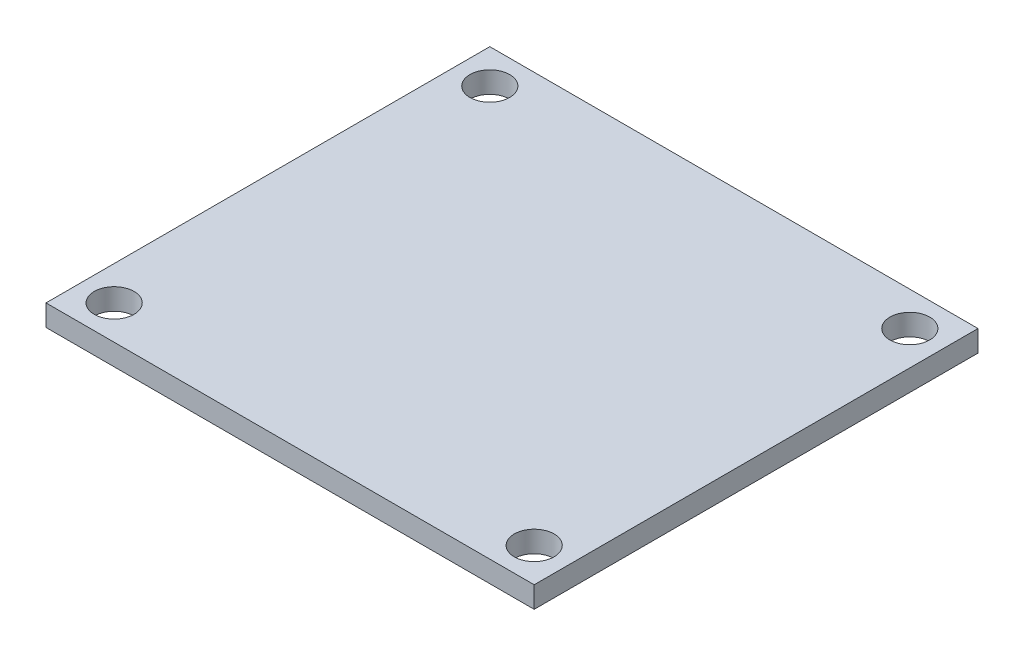
ISO-10303-21;
HEADER;
FILE_DESCRIPTION(('STEP AP214'),'2;1');
FILE_NAME('part.step','',(''),(''),'','','');
FILE_SCHEMA(('AUTOMOTIVE_DESIGN { 1 0 10303 214 1 1 1 1 }'));
ENDSEC;
DATA;
#1=APPLICATION_CONTEXT('core data for automotive mechanical design processes');
#2=APPLICATION_PROTOCOL_DEFINITION('international standard','automotive_design',2000,#1);
#3=PRODUCT_CONTEXT('',#1,'mechanical');
#4=PRODUCT('Part','Part','',(#3));
#5=PRODUCT_RELATED_PRODUCT_CATEGORY('part','',(#4));
#6=PRODUCT_DEFINITION_FORMATION('','',#4);
#7=PRODUCT_DEFINITION_CONTEXT('part definition',#1,'design');
#8=PRODUCT_DEFINITION('design','',#6,#7);
#9=PRODUCT_DEFINITION_SHAPE('','',#8);
#10=(LENGTH_UNIT() NAMED_UNIT(*) SI_UNIT(.MILLI.,.METRE.));
#11=(NAMED_UNIT(*) PLANE_ANGLE_UNIT() SI_UNIT($,.RADIAN.));
#12=(NAMED_UNIT(*) SI_UNIT($,.STERADIAN.) SOLID_ANGLE_UNIT());
#13=UNCERTAINTY_MEASURE_WITH_UNIT(LENGTH_MEASURE(1.E-05),#10,'distance_accuracy_value','');
#14=(GEOMETRIC_REPRESENTATION_CONTEXT(3) GLOBAL_UNCERTAINTY_ASSIGNED_CONTEXT((#13)) GLOBAL_UNIT_ASSIGNED_CONTEXT((#10,
#11,#12)) REPRESENTATION_CONTEXT('',''));
#15=CARTESIAN_POINT('',(0.,0.,0.));
#16=DIRECTION('',(0.,0.,1.));
#17=DIRECTION('',(1.,0.,0.));
#18=AXIS2_PLACEMENT_3D('',#15,#16,#17);
#19=CARTESIAN_POINT('',(0.,1.524,0.));
#20=DIRECTION('',(0.,1.,0.));
#21=DIRECTION('',(0.,0.,1.));
#22=AXIS2_PLACEMENT_3D('',#19,#20,#21);
#23=PLANE('',#22);
#24=CARTESIAN_POINT('',(12.7549615819209,1.524,11.4634361581921));
#25=DIRECTION('',(0.,1.,0.));
#26=DIRECTION('',(0.,0.,1.));
#27=AXIS2_PLACEMENT_3D('',#24,#25,#26);
#28=CIRCLE('',#27,1.4224);
#29=CARTESIAN_POINT('',(12.7549615819209,1.524,10.0410361581921));
#30=VERTEX_POINT('',#29);
#31=EDGE_CURVE('E121',#30,#30,#28,.T.);
#32=ORIENTED_EDGE('',*,*,#31,.F.);
#33=EDGE_LOOP('',(#32));
#34=FACE_BOUND('',#33,.T.);
#35=CARTESIAN_POINT('',(-17.2932384180791,1.524,-15.4097638418079));
#36=DIRECTION('',(0.,1.,0.));
#37=DIRECTION('',(0.,0.,1.));
#38=AXIS2_PLACEMENT_3D('',#35,#36,#37);
#39=CIRCLE('',#38,1.4224);
#40=CARTESIAN_POINT('',(-17.2932384180791,1.524,-16.8321638418079));
#41=VERTEX_POINT('',#40);
#42=EDGE_CURVE('E100',#41,#41,#39,.T.);
#43=ORIENTED_EDGE('',*,*,#42,.F.);
#44=EDGE_LOOP('',(#43));
#45=FACE_BOUND('',#44,.T.);
#46=DIRECTION('',(0.,0.,1.));
#47=VECTOR('',#46,1.);
#48=CARTESIAN_POINT('',(-19.7316384180791,1.524,-17.8481638418079));
#49=LINE('',#48,#47);
#50=CARTESIAN_POINT('',(-19.7316384180791,1.524,-17.8481638418079));
#51=VERTEX_POINT('',#50);
#52=CARTESIAN_POINT('',(-19.7316384180791,1.524,13.9018361581921));
#53=VERTEX_POINT('',#52);
#54=EDGE_CURVE('E85',#51,#53,#49,.T.);
#55=ORIENTED_EDGE('',*,*,#54,.T.);
#56=DIRECTION('',(1.,0.,0.));
#57=VECTOR('',#56,1.);
#58=CARTESIAN_POINT('',(-19.7316384180791,1.524,13.9018361581921));
#59=LINE('',#58,#57);
#60=CARTESIAN_POINT('',(15.1933615819209,1.524,13.9018361581921));
#61=VERTEX_POINT('',#60);
#62=EDGE_CURVE('E80',#53,#61,#59,.T.);
#63=ORIENTED_EDGE('',*,*,#62,.T.);
#64=DIRECTION('',(0.,0.,-1.));
#65=VECTOR('',#64,1.);
#66=CARTESIAN_POINT('',(15.1933615819209,1.524,-17.8481638418079));
#67=LINE('',#66,#65);
#68=CARTESIAN_POINT('',(15.1933615819209,1.524,-17.8481638418079));
#69=VERTEX_POINT('',#68);
#70=EDGE_CURVE('E83',#61,#69,#67,.T.);
#71=ORIENTED_EDGE('',*,*,#70,.T.);
#72=DIRECTION('',(-1.,0.,0.));
#73=VECTOR('',#72,1.);
#74=CARTESIAN_POINT('',(-19.7316384180791,1.524,-17.8481638418079));
#75=LINE('',#74,#73);
#76=EDGE_CURVE('E50',#69,#51,#75,.T.);
#77=ORIENTED_EDGE('',*,*,#76,.T.);
#78=EDGE_LOOP('',(#55,#63,#71,#77));
#79=FACE_BOUND('',#78,.T.);
#80=CARTESIAN_POINT('',(12.7549615819209,1.524,-15.4097638418079));
#81=DIRECTION('',(0.,1.,0.));
#82=DIRECTION('',(0.,0.,1.));
#83=AXIS2_PLACEMENT_3D('',#80,#81,#82);
#84=CIRCLE('',#83,1.4224);
#85=CARTESIAN_POINT('',(12.7549615819209,1.524,-16.8321638418079));
#86=VERTEX_POINT('',#85);
#87=EDGE_CURVE('E115',#86,#86,#84,.T.);
#88=ORIENTED_EDGE('',*,*,#87,.F.);
#89=EDGE_LOOP('',(#88));
#90=FACE_BOUND('',#89,.T.);
#91=CARTESIAN_POINT('',(-17.2932384180791,1.524,11.4634361581921));
#92=DIRECTION('',(0.,1.,0.));
#93=DIRECTION('',(0.,0.,1.));
#94=AXIS2_PLACEMENT_3D('',#91,#92,#93);
#95=CIRCLE('',#94,1.4224);
#96=CARTESIAN_POINT('',(-17.2932384180791,1.524,10.0410361581921));
#97=VERTEX_POINT('',#96);
#98=EDGE_CURVE('E127',#97,#97,#95,.T.);
#99=ORIENTED_EDGE('',*,*,#98,.F.);
#100=EDGE_LOOP('',(#99));
#101=FACE_BOUND('',#100,.T.);
#102=ADVANCED_FACE('F33',(#34,#45,#79,#90,#101),#23,.T.);
#103=CARTESIAN_POINT('',(0.,0.,0.));
#104=DIRECTION('',(0.,1.,0.));
#105=DIRECTION('',(0.,0.,1.));
#106=AXIS2_PLACEMENT_3D('',#103,#104,#105);
#107=PLANE('',#106);
#108=CARTESIAN_POINT('',(12.7549615819209,0.,11.4634361581921));
#109=DIRECTION('',(0.,1.,0.));
#110=DIRECTION('',(0.,0.,1.));
#111=AXIS2_PLACEMENT_3D('',#108,#109,#110);
#112=CIRCLE('',#111,1.4224);
#113=CARTESIAN_POINT('',(12.7549615819209,0.,10.0410361581921));
#114=VERTEX_POINT('',#113);
#115=EDGE_CURVE('E124',#114,#114,#112,.T.);
#116=ORIENTED_EDGE('',*,*,#115,.T.);
#117=EDGE_LOOP('',(#116));
#118=FACE_BOUND('',#117,.T.);
#119=CARTESIAN_POINT('',(-17.2932384180791,0.,-15.4097638418079));
#120=DIRECTION('',(0.,1.,0.));
#121=DIRECTION('',(0.,0.,1.));
#122=AXIS2_PLACEMENT_3D('',#119,#120,#121);
#123=CIRCLE('',#122,1.4224);
#124=CARTESIAN_POINT('',(-17.2932384180791,0.,-16.8321638418079));
#125=VERTEX_POINT('',#124);
#126=EDGE_CURVE('E112',#125,#125,#123,.T.);
#127=ORIENTED_EDGE('',*,*,#126,.T.);
#128=EDGE_LOOP('',(#127));
#129=FACE_BOUND('',#128,.T.);
#130=DIRECTION('',(0.,0.,1.));
#131=VECTOR('',#130,1.);
#132=CARTESIAN_POINT('',(-19.7316384180791,0.,-17.8481638418079));
#133=LINE('',#132,#131);
#134=CARTESIAN_POINT('',(-19.7316384180791,0.,-17.8481638418079));
#135=VERTEX_POINT('',#134);
#136=CARTESIAN_POINT('',(-19.7316384180791,0.,13.9018361581921));
#137=VERTEX_POINT('',#136);
#138=EDGE_CURVE('E97',#135,#137,#133,.T.);
#139=ORIENTED_EDGE('',*,*,#138,.F.);
#140=DIRECTION('',(-1.,0.,0.));
#141=VECTOR('',#140,1.);
#142=CARTESIAN_POINT('',(-19.7316384180791,0.,-17.8481638418079));
#143=LINE('',#142,#141);
#144=CARTESIAN_POINT('',(15.1933615819209,0.,-17.8481638418079));
#145=VERTEX_POINT('',#144);
#146=EDGE_CURVE('E73',#145,#135,#143,.T.);
#147=ORIENTED_EDGE('',*,*,#146,.F.);
#148=DIRECTION('',(0.,0.,-1.));
#149=VECTOR('',#148,1.);
#150=CARTESIAN_POINT('',(15.1933615819209,0.,-17.8481638418079));
#151=LINE('',#150,#149);
#152=CARTESIAN_POINT('',(15.1933615819209,0.,13.9018361581921));
#153=VERTEX_POINT('',#152);
#154=EDGE_CURVE('E67',#153,#145,#151,.T.);
#155=ORIENTED_EDGE('',*,*,#154,.F.);
#156=DIRECTION('',(1.,0.,0.));
#157=VECTOR('',#156,1.);
#158=CARTESIAN_POINT('',(-19.7316384180791,0.,13.9018361581921));
#159=LINE('',#158,#157);
#160=EDGE_CURVE('E89',#137,#153,#159,.T.);
#161=ORIENTED_EDGE('',*,*,#160,.F.);
#162=EDGE_LOOP('',(#139,#147,#155,#161));
#163=FACE_BOUND('',#162,.T.);
#164=CARTESIAN_POINT('',(12.7549615819209,0.,-15.4097638418079));
#165=DIRECTION('',(0.,1.,0.));
#166=DIRECTION('',(0.,0.,1.));
#167=AXIS2_PLACEMENT_3D('',#164,#165,#166);
#168=CIRCLE('',#167,1.4224);
#169=CARTESIAN_POINT('',(12.7549615819209,0.,-16.8321638418079));
#170=VERTEX_POINT('',#169);
#171=EDGE_CURVE('E118',#170,#170,#168,.T.);
#172=ORIENTED_EDGE('',*,*,#171,.T.);
#173=EDGE_LOOP('',(#172));
#174=FACE_BOUND('',#173,.T.);
#175=CARTESIAN_POINT('',(-17.2932384180791,0.,11.4634361581921));
#176=DIRECTION('',(0.,1.,0.));
#177=DIRECTION('',(0.,0.,1.));
#178=AXIS2_PLACEMENT_3D('',#175,#176,#177);
#179=CIRCLE('',#178,1.4224);
#180=CARTESIAN_POINT('',(-17.2932384180791,0.,10.0410361581921));
#181=VERTEX_POINT('',#180);
#182=EDGE_CURVE('E130',#181,#181,#179,.T.);
#183=ORIENTED_EDGE('',*,*,#182,.T.);
#184=EDGE_LOOP('',(#183));
#185=FACE_BOUND('',#184,.T.);
#186=ADVANCED_FACE('F108',(#118,#129,#163,#174,#185),#107,.F.);
#187=CARTESIAN_POINT('',(-19.7316384180791,1.524,-17.8481638418079));
#188=DIRECTION('',(1.,0.,0.));
#189=DIRECTION('',(0.,0.,-1.));
#190=AXIS2_PLACEMENT_3D('',#187,#188,#189);
#191=PLANE('',#190);
#192=ORIENTED_EDGE('',*,*,#138,.T.);
#193=DIRECTION('',(0.,-1.,0.));
#194=VECTOR('',#193,1.);
#195=CARTESIAN_POINT('',(-19.7316384180791,1.524,13.9018361581921));
#196=LINE('',#195,#194);
#197=EDGE_CURVE('E11',#53,#137,#196,.T.);
#198=ORIENTED_EDGE('',*,*,#197,.F.);
#199=ORIENTED_EDGE('',*,*,#54,.F.);
#200=DIRECTION('',(0.,-1.,0.));
#201=VECTOR('',#200,1.);
#202=CARTESIAN_POINT('',(-19.7316384180791,1.524,-17.8481638418079));
#203=LINE('',#202,#201);
#204=EDGE_CURVE('E93',#51,#135,#203,.T.);
#205=ORIENTED_EDGE('',*,*,#204,.T.);
#206=EDGE_LOOP('',(#192,#198,#199,#205));
#207=FACE_BOUND('',#206,.T.);
#208=ADVANCED_FACE('F35',(#207),#191,.F.);
#209=CARTESIAN_POINT('',(-19.7316384180791,1.524,13.9018361581921));
#210=DIRECTION('',(0.,0.,-1.));
#211=DIRECTION('',(-1.,0.,0.));
#212=AXIS2_PLACEMENT_3D('',#209,#210,#211);
#213=PLANE('',#212);
#214=ORIENTED_EDGE('',*,*,#160,.T.);
#215=DIRECTION('',(0.,-1.,0.));
#216=VECTOR('',#215,1.);
#217=CARTESIAN_POINT('',(15.1933615819209,1.524,13.9018361581921));
#218=LINE('',#217,#216);
#219=EDGE_CURVE('E42',#61,#153,#218,.T.);
#220=ORIENTED_EDGE('',*,*,#219,.F.);
#221=ORIENTED_EDGE('',*,*,#62,.F.);
#222=ORIENTED_EDGE('',*,*,#197,.T.);
#223=EDGE_LOOP('',(#214,#220,#221,#222));
#224=FACE_BOUND('',#223,.T.);
#225=ADVANCED_FACE('F88',(#224),#213,.F.);
#226=CARTESIAN_POINT('',(15.1933615819209,1.524,-17.8481638418079));
#227=DIRECTION('',(-1.,0.,0.));
#228=DIRECTION('',(0.,0.,1.));
#229=AXIS2_PLACEMENT_3D('',#226,#227,#228);
#230=PLANE('',#229);
#231=ORIENTED_EDGE('',*,*,#154,.T.);
#232=DIRECTION('',(0.,-1.,0.));
#233=VECTOR('',#232,1.);
#234=CARTESIAN_POINT('',(15.1933615819209,1.524,-17.8481638418079));
#235=LINE('',#234,#233);
#236=EDGE_CURVE('E90',#69,#145,#235,.T.);
#237=ORIENTED_EDGE('',*,*,#236,.F.);
#238=ORIENTED_EDGE('',*,*,#70,.F.);
#239=ORIENTED_EDGE('',*,*,#219,.T.);
#240=EDGE_LOOP('',(#231,#237,#238,#239));
#241=FACE_BOUND('',#240,.T.);
#242=ADVANCED_FACE('F91',(#241),#230,.F.);
#243=CARTESIAN_POINT('',(-19.7316384180791,1.524,-17.8481638418079));
#244=DIRECTION('',(0.,0.,1.));
#245=DIRECTION('',(1.,0.,0.));
#246=AXIS2_PLACEMENT_3D('',#243,#244,#245);
#247=PLANE('',#246);
#248=ORIENTED_EDGE('',*,*,#146,.T.);
#249=ORIENTED_EDGE('',*,*,#204,.F.);
#250=ORIENTED_EDGE('',*,*,#76,.F.);
#251=ORIENTED_EDGE('',*,*,#236,.T.);
#252=EDGE_LOOP('',(#248,#249,#250,#251));
#253=FACE_BOUND('',#252,.T.);
#254=ADVANCED_FACE('F105',(#253),#247,.F.);
#255=CARTESIAN_POINT('',(-17.2932384180791,1.524,-15.4097638418079));
#256=DIRECTION('',(0.,-1.,0.));
#257=DIRECTION('',(0.,0.,-1.));
#258=AXIS2_PLACEMENT_3D('',#255,#256,#257);
#259=CYLINDRICAL_SURFACE('',#258,1.4224);
#260=CARTESIAN_POINT('',(-17.2932384180791,1.524,-16.8321638418079));
#261=CARTESIAN_POINT('',(-17.2932384180791,1.508125,-16.8321638418079));
#262=CARTESIAN_POINT('',(-17.2932384180791,1.49225,-16.8321638418079));
#263=CARTESIAN_POINT('',(-17.2932384180791,1.4605,-16.8321638418079));
#264=CARTESIAN_POINT('',(-17.2932384180791,1.444625,-16.8321638418079));
#265=CARTESIAN_POINT('',(-17.2932384180791,1.412875,-16.8321638418079));
#266=CARTESIAN_POINT('',(-17.2932384180791,1.397,-16.8321638418079));
#267=CARTESIAN_POINT('',(-17.2932384180791,1.36525,-16.8321638418079));
#268=CARTESIAN_POINT('',(-17.2932384180791,1.349375,-16.8321638418079));
#269=CARTESIAN_POINT('',(-17.2932384180791,1.317625,-16.8321638418079));
#270=CARTESIAN_POINT('',(-17.2932384180791,1.30175,-16.8321638418079));
#271=CARTESIAN_POINT('',(-17.2932384180791,1.27,-16.8321638418079));
#272=CARTESIAN_POINT('',(-17.2932384180791,1.254125,-16.8321638418079));
#273=CARTESIAN_POINT('',(-17.2932384180791,1.222375,-16.8321638418079));
#274=CARTESIAN_POINT('',(-17.2932384180791,1.2065,-16.8321638418079));
#275=CARTESIAN_POINT('',(-17.2932384180791,1.17475,-16.8321638418079));
#276=CARTESIAN_POINT('',(-17.2932384180791,1.158875,-16.8321638418079));
#277=CARTESIAN_POINT('',(-17.2932384180791,1.127125,-16.8321638418079));
#278=CARTESIAN_POINT('',(-17.2932384180791,1.11125,-16.8321638418079));
#279=CARTESIAN_POINT('',(-17.2932384180791,1.0795,-16.8321638418079));
#280=CARTESIAN_POINT('',(-17.2932384180791,1.063625,-16.8321638418079));
#281=CARTESIAN_POINT('',(-17.2932384180791,1.031875,-16.8321638418079));
#282=CARTESIAN_POINT('',(-17.2932384180791,1.016,-16.8321638418079));
#283=CARTESIAN_POINT('',(-17.2932384180791,0.98425,-16.8321638418079));
#284=CARTESIAN_POINT('',(-17.2932384180791,0.968375,-16.8321638418079));
#285=CARTESIAN_POINT('',(-17.2932384180791,0.936625,-16.8321638418079));
#286=CARTESIAN_POINT('',(-17.2932384180791,0.92075,-16.8321638418079));
#287=CARTESIAN_POINT('',(-17.2932384180791,0.889,-16.8321638418079));
#288=CARTESIAN_POINT('',(-17.2932384180791,0.873125,-16.8321638418079));
#289=CARTESIAN_POINT('',(-17.2932384180791,0.841375,-16.8321638418079));
#290=CARTESIAN_POINT('',(-17.2932384180791,0.8255,-16.8321638418079));
#291=CARTESIAN_POINT('',(-17.2932384180791,0.79375,-16.8321638418079));
#292=CARTESIAN_POINT('',(-17.2932384180791,0.777875,-16.8321638418079));
#293=CARTESIAN_POINT('',(-17.2932384180791,0.746125,-16.8321638418079));
#294=CARTESIAN_POINT('',(-17.2932384180791,0.73025,-16.8321638418079));
#295=CARTESIAN_POINT('',(-17.2932384180791,0.6985,-16.8321638418079));
#296=CARTESIAN_POINT('',(-17.2932384180791,0.682625,-16.8321638418079));
#297=CARTESIAN_POINT('',(-17.2932384180791,0.650875,-16.8321638418079));
#298=CARTESIAN_POINT('',(-17.2932384180791,0.635,-16.8321638418079));
#299=CARTESIAN_POINT('',(-17.2932384180791,0.60325,-16.8321638418079));
#300=CARTESIAN_POINT('',(-17.2932384180791,0.587375,-16.8321638418079));
#301=CARTESIAN_POINT('',(-17.2932384180791,0.555625,-16.8321638418079));
#302=CARTESIAN_POINT('',(-17.2932384180791,0.53975,-16.8321638418079));
#303=CARTESIAN_POINT('',(-17.2932384180791,0.508,-16.8321638418079));
#304=CARTESIAN_POINT('',(-17.2932384180791,0.492125,-16.8321638418079));
#305=CARTESIAN_POINT('',(-17.2932384180791,0.460375,-16.8321638418079));
#306=CARTESIAN_POINT('',(-17.2932384180791,0.4445,-16.8321638418079));
#307=CARTESIAN_POINT('',(-17.2932384180791,0.41275,-16.8321638418079));
#308=CARTESIAN_POINT('',(-17.2932384180791,0.396875,-16.8321638418079));
#309=CARTESIAN_POINT('',(-17.2932384180791,0.365125,-16.8321638418079));
#310=CARTESIAN_POINT('',(-17.2932384180791,0.34925,-16.8321638418079));
#311=CARTESIAN_POINT('',(-17.2932384180791,0.3175,-16.8321638418079));
#312=CARTESIAN_POINT('',(-17.2932384180791,0.301625,-16.8321638418079));
#313=CARTESIAN_POINT('',(-17.2932384180791,0.269875,-16.8321638418079));
#314=CARTESIAN_POINT('',(-17.2932384180791,0.254,-16.8321638418079));
#315=CARTESIAN_POINT('',(-17.2932384180791,0.22225,-16.8321638418079));
#316=CARTESIAN_POINT('',(-17.2932384180791,0.206375,-16.8321638418079));
#317=CARTESIAN_POINT('',(-17.2932384180791,0.174625,-16.8321638418079));
#318=CARTESIAN_POINT('',(-17.2932384180791,0.15875,-16.8321638418079));
#319=CARTESIAN_POINT('',(-17.2932384180791,0.127,-16.8321638418079));
#320=CARTESIAN_POINT('',(-17.2932384180791,0.111125,-16.8321638418079));
#321=CARTESIAN_POINT('',(-17.2932384180791,0.079375,-16.8321638418079));
#322=CARTESIAN_POINT('',(-17.2932384180791,0.0635,-16.8321638418079));
#323=CARTESIAN_POINT('',(-17.2932384180791,0.0317499999999999,-16.8321638418079));
#324=CARTESIAN_POINT('',(-17.2932384180791,0.015875,-16.8321638418079));
#325=CARTESIAN_POINT('',(-17.2932384180791,0.,-16.8321638418079));
#326=B_SPLINE_CURVE_WITH_KNOTS('',3,(#260,#261,#262,#263,#264,#265,#266,#267,#268,#269,#270,
#271,#272,#273,#274,#275,#276,#277,#278,#279,#280,#281,#282,#283,#284,#285,#286,#287,#288,#289,
#290,#291,#292,#293,#294,#295,#296,#297,#298,#299,#300,#301,#302,#303,#304,#305,#306,#307,#308,
#309,#310,#311,#312,#313,#314,#315,#316,#317,#318,#319,#320,#321,#322,#323,#324,#325),
.UNSPECIFIED.,.F.,.F.,(4,2,2,2,2,2,2,2,2,2,2,2,2,2,2,2,2,2,2,2,2,2,2,2,2,2,2,2,2,2,2,2,4),(0.,
0.0476249999999999,0.0952499999999998,0.142875,0.1905,0.238125,0.28575,0.333375,0.381,0.428625,
0.47625,0.523875,0.5715,0.619125,0.66675,0.714375,0.762,0.809625,0.85725,0.904875,0.9525,
1.000125,1.04775,1.095375,1.143,1.190625,1.23825,1.285875,1.3335,1.381125,1.42875,1.476375,
1.524),.UNSPECIFIED.);
#327=EDGE_CURVE('BSEAM150',#41,#125,#326,.T.);
#328=ORIENTED_EDGE('',*,*,#42,.T.);
#329=ORIENTED_EDGE('',*,*,#126,.F.);
#330=ORIENTED_EDGE('',*,*,#327,.T.);
#331=ORIENTED_EDGE('',*,*,#327,.F.);
#332=EDGE_LOOP('',(#328,#330,#329,#331));
#333=FACE_BOUND('',#332,.T.);
#334=ADVANCED_FACE('F150',(#333),#259,.F.);
#335=CARTESIAN_POINT('',(12.7549615819209,1.524,-15.4097638418079));
#336=DIRECTION('',(0.,-1.,0.));
#337=DIRECTION('',(0.,0.,-1.));
#338=AXIS2_PLACEMENT_3D('',#335,#336,#337);
#339=CYLINDRICAL_SURFACE('',#338,1.4224);
#340=CARTESIAN_POINT('',(12.7549615819209,1.524,-16.8321638418079));
#341=CARTESIAN_POINT('',(12.7549615819209,1.508125,-16.8321638418079));
#342=CARTESIAN_POINT('',(12.7549615819209,1.49225,-16.8321638418079));
#343=CARTESIAN_POINT('',(12.7549615819209,1.4605,-16.8321638418079));
#344=CARTESIAN_POINT('',(12.7549615819209,1.444625,-16.8321638418079));
#345=CARTESIAN_POINT('',(12.7549615819209,1.412875,-16.8321638418079));
#346=CARTESIAN_POINT('',(12.7549615819209,1.397,-16.8321638418079));
#347=CARTESIAN_POINT('',(12.7549615819209,1.36525,-16.8321638418079));
#348=CARTESIAN_POINT('',(12.7549615819209,1.349375,-16.8321638418079));
#349=CARTESIAN_POINT('',(12.7549615819209,1.317625,-16.8321638418079));
#350=CARTESIAN_POINT('',(12.7549615819209,1.30175,-16.8321638418079));
#351=CARTESIAN_POINT('',(12.7549615819209,1.27,-16.8321638418079));
#352=CARTESIAN_POINT('',(12.7549615819209,1.254125,-16.8321638418079));
#353=CARTESIAN_POINT('',(12.7549615819209,1.222375,-16.8321638418079));
#354=CARTESIAN_POINT('',(12.7549615819209,1.2065,-16.8321638418079));
#355=CARTESIAN_POINT('',(12.7549615819209,1.17475,-16.8321638418079));
#356=CARTESIAN_POINT('',(12.7549615819209,1.158875,-16.8321638418079));
#357=CARTESIAN_POINT('',(12.7549615819209,1.127125,-16.8321638418079));
#358=CARTESIAN_POINT('',(12.7549615819209,1.11125,-16.8321638418079));
#359=CARTESIAN_POINT('',(12.7549615819209,1.0795,-16.8321638418079));
#360=CARTESIAN_POINT('',(12.7549615819209,1.063625,-16.8321638418079));
#361=CARTESIAN_POINT('',(12.7549615819209,1.031875,-16.8321638418079));
#362=CARTESIAN_POINT('',(12.7549615819209,1.016,-16.8321638418079));
#363=CARTESIAN_POINT('',(12.7549615819209,0.98425,-16.8321638418079));
#364=CARTESIAN_POINT('',(12.7549615819209,0.968375,-16.8321638418079));
#365=CARTESIAN_POINT('',(12.7549615819209,0.936625,-16.8321638418079));
#366=CARTESIAN_POINT('',(12.7549615819209,0.92075,-16.8321638418079));
#367=CARTESIAN_POINT('',(12.7549615819209,0.889,-16.8321638418079));
#368=CARTESIAN_POINT('',(12.7549615819209,0.873125,-16.8321638418079));
#369=CARTESIAN_POINT('',(12.7549615819209,0.841375,-16.8321638418079));
#370=CARTESIAN_POINT('',(12.7549615819209,0.8255,-16.8321638418079));
#371=CARTESIAN_POINT('',(12.7549615819209,0.79375,-16.8321638418079));
#372=CARTESIAN_POINT('',(12.7549615819209,0.777875,-16.8321638418079));
#373=CARTESIAN_POINT('',(12.7549615819209,0.746125,-16.8321638418079));
#374=CARTESIAN_POINT('',(12.7549615819209,0.73025,-16.8321638418079));
#375=CARTESIAN_POINT('',(12.7549615819209,0.6985,-16.8321638418079));
#376=CARTESIAN_POINT('',(12.7549615819209,0.682625,-16.8321638418079));
#377=CARTESIAN_POINT('',(12.7549615819209,0.650875,-16.8321638418079));
#378=CARTESIAN_POINT('',(12.7549615819209,0.635,-16.8321638418079));
#379=CARTESIAN_POINT('',(12.7549615819209,0.60325,-16.8321638418079));
#380=CARTESIAN_POINT('',(12.7549615819209,0.587375,-16.8321638418079));
#381=CARTESIAN_POINT('',(12.7549615819209,0.555625,-16.8321638418079));
#382=CARTESIAN_POINT('',(12.7549615819209,0.53975,-16.8321638418079));
#383=CARTESIAN_POINT('',(12.7549615819209,0.508,-16.8321638418079));
#384=CARTESIAN_POINT('',(12.7549615819209,0.492125,-16.8321638418079));
#385=CARTESIAN_POINT('',(12.7549615819209,0.460375,-16.8321638418079));
#386=CARTESIAN_POINT('',(12.7549615819209,0.4445,-16.8321638418079));
#387=CARTESIAN_POINT('',(12.7549615819209,0.41275,-16.8321638418079));
#388=CARTESIAN_POINT('',(12.7549615819209,0.396875,-16.8321638418079));
#389=CARTESIAN_POINT('',(12.7549615819209,0.365125,-16.8321638418079));
#390=CARTESIAN_POINT('',(12.7549615819209,0.34925,-16.8321638418079));
#391=CARTESIAN_POINT('',(12.7549615819209,0.3175,-16.8321638418079));
#392=CARTESIAN_POINT('',(12.7549615819209,0.301625,-16.8321638418079));
#393=CARTESIAN_POINT('',(12.7549615819209,0.269875,-16.8321638418079));
#394=CARTESIAN_POINT('',(12.7549615819209,0.254,-16.8321638418079));
#395=CARTESIAN_POINT('',(12.7549615819209,0.22225,-16.8321638418079));
#396=CARTESIAN_POINT('',(12.7549615819209,0.206375,-16.8321638418079));
#397=CARTESIAN_POINT('',(12.7549615819209,0.174625,-16.8321638418079));
#398=CARTESIAN_POINT('',(12.7549615819209,0.15875,-16.8321638418079));
#399=CARTESIAN_POINT('',(12.7549615819209,0.127,-16.8321638418079));
#400=CARTESIAN_POINT('',(12.7549615819209,0.111125,-16.8321638418079));
#401=CARTESIAN_POINT('',(12.7549615819209,0.079375,-16.8321638418079));
#402=CARTESIAN_POINT('',(12.7549615819209,0.0635,-16.8321638418079));
#403=CARTESIAN_POINT('',(12.7549615819209,0.0317499999999999,-16.8321638418079));
#404=CARTESIAN_POINT('',(12.7549615819209,0.015875,-16.8321638418079));
#405=CARTESIAN_POINT('',(12.7549615819209,0.,-16.8321638418079));
#406=B_SPLINE_CURVE_WITH_KNOTS('',3,(#340,#341,#342,#343,#344,#345,#346,#347,#348,#349,#350,
#351,#352,#353,#354,#355,#356,#357,#358,#359,#360,#361,#362,#363,#364,#365,#366,#367,#368,#369,
#370,#371,#372,#373,#374,#375,#376,#377,#378,#379,#380,#381,#382,#383,#384,#385,#386,#387,#388,
#389,#390,#391,#392,#393,#394,#395,#396,#397,#398,#399,#400,#401,#402,#403,#404,#405),
.UNSPECIFIED.,.F.,.F.,(4,2,2,2,2,2,2,2,2,2,2,2,2,2,2,2,2,2,2,2,2,2,2,2,2,2,2,2,2,2,2,2,4),(0.,
0.0476249999999999,0.0952499999999998,0.142875,0.1905,0.238125,0.28575,0.333375,0.381,0.428625,
0.47625,0.523875,0.5715,0.619125,0.66675,0.714375,0.762,0.809625,0.85725,0.904875,0.9525,
1.000125,1.04775,1.095375,1.143,1.190625,1.23825,1.285875,1.3335,1.381125,1.42875,1.476375,
1.524),.UNSPECIFIED.);
#407=EDGE_CURVE('BSEAM196',#86,#170,#406,.T.);
#408=ORIENTED_EDGE('',*,*,#87,.T.);
#409=ORIENTED_EDGE('',*,*,#171,.F.);
#410=ORIENTED_EDGE('',*,*,#407,.T.);
#411=ORIENTED_EDGE('',*,*,#407,.F.);
#412=EDGE_LOOP('',(#408,#410,#409,#411));
#413=FACE_BOUND('',#412,.T.);
#414=ADVANCED_FACE('F196',(#413),#339,.F.);
#415=CARTESIAN_POINT('',(12.7549615819209,1.524,11.4634361581921));
#416=DIRECTION('',(0.,-1.,0.));
#417=DIRECTION('',(0.,0.,-1.));
#418=AXIS2_PLACEMENT_3D('',#415,#416,#417);
#419=CYLINDRICAL_SURFACE('',#418,1.4224);
#420=CARTESIAN_POINT('',(12.7549615819209,1.524,10.0410361581921));
#421=CARTESIAN_POINT('',(12.7549615819209,1.508125,10.0410361581921));
#422=CARTESIAN_POINT('',(12.7549615819209,1.49225,10.0410361581921));
#423=CARTESIAN_POINT('',(12.7549615819209,1.4605,10.0410361581921));
#424=CARTESIAN_POINT('',(12.7549615819209,1.444625,10.0410361581921));
#425=CARTESIAN_POINT('',(12.7549615819209,1.412875,10.0410361581921));
#426=CARTESIAN_POINT('',(12.7549615819209,1.397,10.0410361581921));
#427=CARTESIAN_POINT('',(12.7549615819209,1.36525,10.0410361581921));
#428=CARTESIAN_POINT('',(12.7549615819209,1.349375,10.0410361581921));
#429=CARTESIAN_POINT('',(12.7549615819209,1.317625,10.0410361581921));
#430=CARTESIAN_POINT('',(12.7549615819209,1.30175,10.0410361581921));
#431=CARTESIAN_POINT('',(12.7549615819209,1.27,10.0410361581921));
#432=CARTESIAN_POINT('',(12.7549615819209,1.254125,10.0410361581921));
#433=CARTESIAN_POINT('',(12.7549615819209,1.222375,10.0410361581921));
#434=CARTESIAN_POINT('',(12.7549615819209,1.2065,10.0410361581921));
#435=CARTESIAN_POINT('',(12.7549615819209,1.17475,10.0410361581921));
#436=CARTESIAN_POINT('',(12.7549615819209,1.158875,10.0410361581921));
#437=CARTESIAN_POINT('',(12.7549615819209,1.127125,10.0410361581921));
#438=CARTESIAN_POINT('',(12.7549615819209,1.11125,10.0410361581921));
#439=CARTESIAN_POINT('',(12.7549615819209,1.0795,10.0410361581921));
#440=CARTESIAN_POINT('',(12.7549615819209,1.063625,10.0410361581921));
#441=CARTESIAN_POINT('',(12.7549615819209,1.031875,10.0410361581921));
#442=CARTESIAN_POINT('',(12.7549615819209,1.016,10.0410361581921));
#443=CARTESIAN_POINT('',(12.7549615819209,0.98425,10.0410361581921));
#444=CARTESIAN_POINT('',(12.7549615819209,0.968375,10.0410361581921));
#445=CARTESIAN_POINT('',(12.7549615819209,0.936625,10.0410361581921));
#446=CARTESIAN_POINT('',(12.7549615819209,0.92075,10.0410361581921));
#447=CARTESIAN_POINT('',(12.7549615819209,0.889,10.0410361581921));
#448=CARTESIAN_POINT('',(12.7549615819209,0.873125,10.0410361581921));
#449=CARTESIAN_POINT('',(12.7549615819209,0.841375,10.0410361581921));
#450=CARTESIAN_POINT('',(12.7549615819209,0.8255,10.0410361581921));
#451=CARTESIAN_POINT('',(12.7549615819209,0.79375,10.0410361581921));
#452=CARTESIAN_POINT('',(12.7549615819209,0.777875,10.0410361581921));
#453=CARTESIAN_POINT('',(12.7549615819209,0.746125,10.0410361581921));
#454=CARTESIAN_POINT('',(12.7549615819209,0.73025,10.0410361581921));
#455=CARTESIAN_POINT('',(12.7549615819209,0.6985,10.0410361581921));
#456=CARTESIAN_POINT('',(12.7549615819209,0.682625,10.0410361581921));
#457=CARTESIAN_POINT('',(12.7549615819209,0.650875,10.0410361581921));
#458=CARTESIAN_POINT('',(12.7549615819209,0.635,10.0410361581921));
#459=CARTESIAN_POINT('',(12.7549615819209,0.60325,10.0410361581921));
#460=CARTESIAN_POINT('',(12.7549615819209,0.587375,10.0410361581921));
#461=CARTESIAN_POINT('',(12.7549615819209,0.555625,10.0410361581921));
#462=CARTESIAN_POINT('',(12.7549615819209,0.53975,10.0410361581921));
#463=CARTESIAN_POINT('',(12.7549615819209,0.508,10.0410361581921));
#464=CARTESIAN_POINT('',(12.7549615819209,0.492125,10.0410361581921));
#465=CARTESIAN_POINT('',(12.7549615819209,0.460375,10.0410361581921));
#466=CARTESIAN_POINT('',(12.7549615819209,0.4445,10.0410361581921));
#467=CARTESIAN_POINT('',(12.7549615819209,0.41275,10.0410361581921));
#468=CARTESIAN_POINT('',(12.7549615819209,0.396875,10.0410361581921));
#469=CARTESIAN_POINT('',(12.7549615819209,0.365125,10.0410361581921));
#470=CARTESIAN_POINT('',(12.7549615819209,0.34925,10.0410361581921));
#471=CARTESIAN_POINT('',(12.7549615819209,0.3175,10.0410361581921));
#472=CARTESIAN_POINT('',(12.7549615819209,0.301625,10.0410361581921));
#473=CARTESIAN_POINT('',(12.7549615819209,0.269875,10.0410361581921));
#474=CARTESIAN_POINT('',(12.7549615819209,0.254,10.0410361581921));
#475=CARTESIAN_POINT('',(12.7549615819209,0.22225,10.0410361581921));
#476=CARTESIAN_POINT('',(12.7549615819209,0.206375,10.0410361581921));
#477=CARTESIAN_POINT('',(12.7549615819209,0.174625,10.0410361581921));
#478=CARTESIAN_POINT('',(12.7549615819209,0.15875,10.0410361581921));
#479=CARTESIAN_POINT('',(12.7549615819209,0.127,10.0410361581921));
#480=CARTESIAN_POINT('',(12.7549615819209,0.111125,10.0410361581921));
#481=CARTESIAN_POINT('',(12.7549615819209,0.079375,10.0410361581921));
#482=CARTESIAN_POINT('',(12.7549615819209,0.0635,10.0410361581921));
#483=CARTESIAN_POINT('',(12.7549615819209,0.0317499999999999,10.0410361581921));
#484=CARTESIAN_POINT('',(12.7549615819209,0.015875,10.0410361581921));
#485=CARTESIAN_POINT('',(12.7549615819209,0.,10.0410361581921));
#486=B_SPLINE_CURVE_WITH_KNOTS('',3,(#420,#421,#422,#423,#424,#425,#426,#427,#428,#429,#430,
#431,#432,#433,#434,#435,#436,#437,#438,#439,#440,#441,#442,#443,#444,#445,#446,#447,#448,#449,
#450,#451,#452,#453,#454,#455,#456,#457,#458,#459,#460,#461,#462,#463,#464,#465,#466,#467,#468,
#469,#470,#471,#472,#473,#474,#475,#476,#477,#478,#479,#480,#481,#482,#483,#484,#485),
.UNSPECIFIED.,.F.,.F.,(4,2,2,2,2,2,2,2,2,2,2,2,2,2,2,2,2,2,2,2,2,2,2,2,2,2,2,2,2,2,2,2,4),(0.,
0.0476249999999999,0.0952499999999998,0.142875,0.1905,0.238125,0.28575,0.333375,0.381,0.428625,
0.47625,0.523875,0.5715,0.619125,0.66675,0.714375,0.762,0.809625,0.85725,0.904875,0.9525,
1.000125,1.04775,1.095375,1.143,1.190625,1.23825,1.285875,1.3335,1.381125,1.42875,1.476375,
1.524),.UNSPECIFIED.);
#487=EDGE_CURVE('BSEAM204',#30,#114,#486,.T.);
#488=ORIENTED_EDGE('',*,*,#31,.T.);
#489=ORIENTED_EDGE('',*,*,#115,.F.);
#490=ORIENTED_EDGE('',*,*,#487,.T.);
#491=ORIENTED_EDGE('',*,*,#487,.F.);
#492=EDGE_LOOP('',(#488,#490,#489,#491));
#493=FACE_BOUND('',#492,.T.);
#494=ADVANCED_FACE('F204',(#493),#419,.F.);
#495=CARTESIAN_POINT('',(-17.2932384180791,1.524,11.4634361581921));
#496=DIRECTION('',(0.,-1.,0.));
#497=DIRECTION('',(0.,0.,-1.));
#498=AXIS2_PLACEMENT_3D('',#495,#496,#497);
#499=CYLINDRICAL_SURFACE('',#498,1.4224);
#500=CARTESIAN_POINT('',(-17.2932384180791,1.524,10.0410361581921));
#501=CARTESIAN_POINT('',(-17.2932384180791,1.508125,10.0410361581921));
#502=CARTESIAN_POINT('',(-17.2932384180791,1.49225,10.0410361581921));
#503=CARTESIAN_POINT('',(-17.2932384180791,1.4605,10.0410361581921));
#504=CARTESIAN_POINT('',(-17.2932384180791,1.444625,10.0410361581921));
#505=CARTESIAN_POINT('',(-17.2932384180791,1.412875,10.0410361581921));
#506=CARTESIAN_POINT('',(-17.2932384180791,1.397,10.0410361581921));
#507=CARTESIAN_POINT('',(-17.2932384180791,1.36525,10.0410361581921));
#508=CARTESIAN_POINT('',(-17.2932384180791,1.349375,10.0410361581921));
#509=CARTESIAN_POINT('',(-17.2932384180791,1.317625,10.0410361581921));
#510=CARTESIAN_POINT('',(-17.2932384180791,1.30175,10.0410361581921));
#511=CARTESIAN_POINT('',(-17.2932384180791,1.27,10.0410361581921));
#512=CARTESIAN_POINT('',(-17.2932384180791,1.254125,10.0410361581921));
#513=CARTESIAN_POINT('',(-17.2932384180791,1.222375,10.0410361581921));
#514=CARTESIAN_POINT('',(-17.2932384180791,1.2065,10.0410361581921));
#515=CARTESIAN_POINT('',(-17.2932384180791,1.17475,10.0410361581921));
#516=CARTESIAN_POINT('',(-17.2932384180791,1.158875,10.0410361581921));
#517=CARTESIAN_POINT('',(-17.2932384180791,1.127125,10.0410361581921));
#518=CARTESIAN_POINT('',(-17.2932384180791,1.11125,10.0410361581921));
#519=CARTESIAN_POINT('',(-17.2932384180791,1.0795,10.0410361581921));
#520=CARTESIAN_POINT('',(-17.2932384180791,1.063625,10.0410361581921));
#521=CARTESIAN_POINT('',(-17.2932384180791,1.031875,10.0410361581921));
#522=CARTESIAN_POINT('',(-17.2932384180791,1.016,10.0410361581921));
#523=CARTESIAN_POINT('',(-17.2932384180791,0.98425,10.0410361581921));
#524=CARTESIAN_POINT('',(-17.2932384180791,0.968375,10.0410361581921));
#525=CARTESIAN_POINT('',(-17.2932384180791,0.936625,10.0410361581921));
#526=CARTESIAN_POINT('',(-17.2932384180791,0.92075,10.0410361581921));
#527=CARTESIAN_POINT('',(-17.2932384180791,0.889,10.0410361581921));
#528=CARTESIAN_POINT('',(-17.2932384180791,0.873125,10.0410361581921));
#529=CARTESIAN_POINT('',(-17.2932384180791,0.841375,10.0410361581921));
#530=CARTESIAN_POINT('',(-17.2932384180791,0.8255,10.0410361581921));
#531=CARTESIAN_POINT('',(-17.2932384180791,0.79375,10.0410361581921));
#532=CARTESIAN_POINT('',(-17.2932384180791,0.777875,10.0410361581921));
#533=CARTESIAN_POINT('',(-17.2932384180791,0.746125,10.0410361581921));
#534=CARTESIAN_POINT('',(-17.2932384180791,0.73025,10.0410361581921));
#535=CARTESIAN_POINT('',(-17.2932384180791,0.6985,10.0410361581921));
#536=CARTESIAN_POINT('',(-17.2932384180791,0.682625,10.0410361581921));
#537=CARTESIAN_POINT('',(-17.2932384180791,0.650875,10.0410361581921));
#538=CARTESIAN_POINT('',(-17.2932384180791,0.635,10.0410361581921));
#539=CARTESIAN_POINT('',(-17.2932384180791,0.60325,10.0410361581921));
#540=CARTESIAN_POINT('',(-17.2932384180791,0.587375,10.0410361581921));
#541=CARTESIAN_POINT('',(-17.2932384180791,0.555625,10.0410361581921));
#542=CARTESIAN_POINT('',(-17.2932384180791,0.53975,10.0410361581921));
#543=CARTESIAN_POINT('',(-17.2932384180791,0.508,10.0410361581921));
#544=CARTESIAN_POINT('',(-17.2932384180791,0.492125,10.0410361581921));
#545=CARTESIAN_POINT('',(-17.2932384180791,0.460375,10.0410361581921));
#546=CARTESIAN_POINT('',(-17.2932384180791,0.4445,10.0410361581921));
#547=CARTESIAN_POINT('',(-17.2932384180791,0.41275,10.0410361581921));
#548=CARTESIAN_POINT('',(-17.2932384180791,0.396875,10.0410361581921));
#549=CARTESIAN_POINT('',(-17.2932384180791,0.365125,10.0410361581921));
#550=CARTESIAN_POINT('',(-17.2932384180791,0.34925,10.0410361581921));
#551=CARTESIAN_POINT('',(-17.2932384180791,0.3175,10.0410361581921));
#552=CARTESIAN_POINT('',(-17.2932384180791,0.301625,10.0410361581921));
#553=CARTESIAN_POINT('',(-17.2932384180791,0.269875,10.0410361581921));
#554=CARTESIAN_POINT('',(-17.2932384180791,0.254,10.0410361581921));
#555=CARTESIAN_POINT('',(-17.2932384180791,0.22225,10.0410361581921));
#556=CARTESIAN_POINT('',(-17.2932384180791,0.206375,10.0410361581921));
#557=CARTESIAN_POINT('',(-17.2932384180791,0.174625,10.0410361581921));
#558=CARTESIAN_POINT('',(-17.2932384180791,0.15875,10.0410361581921));
#559=CARTESIAN_POINT('',(-17.2932384180791,0.127,10.0410361581921));
#560=CARTESIAN_POINT('',(-17.2932384180791,0.111125,10.0410361581921));
#561=CARTESIAN_POINT('',(-17.2932384180791,0.079375,10.0410361581921));
#562=CARTESIAN_POINT('',(-17.2932384180791,0.0635,10.0410361581921));
#563=CARTESIAN_POINT('',(-17.2932384180791,0.0317499999999999,10.0410361581921));
#564=CARTESIAN_POINT('',(-17.2932384180791,0.015875,10.0410361581921));
#565=CARTESIAN_POINT('',(-17.2932384180791,0.,10.0410361581921));
#566=B_SPLINE_CURVE_WITH_KNOTS('',3,(#500,#501,#502,#503,#504,#505,#506,#507,#508,#509,#510,
#511,#512,#513,#514,#515,#516,#517,#518,#519,#520,#521,#522,#523,#524,#525,#526,#527,#528,#529,
#530,#531,#532,#533,#534,#535,#536,#537,#538,#539,#540,#541,#542,#543,#544,#545,#546,#547,#548,
#549,#550,#551,#552,#553,#554,#555,#556,#557,#558,#559,#560,#561,#562,#563,#564,#565),
.UNSPECIFIED.,.F.,.F.,(4,2,2,2,2,2,2,2,2,2,2,2,2,2,2,2,2,2,2,2,2,2,2,2,2,2,2,2,2,2,2,2,4),(0.,
0.0476249999999999,0.0952499999999998,0.142875,0.1905,0.238125,0.28575,0.333375,0.381,0.428625,
0.47625,0.523875,0.5715,0.619125,0.66675,0.714375,0.762,0.809625,0.85725,0.904875,0.9525,
1.000125,1.04775,1.095375,1.143,1.190625,1.23825,1.285875,1.3335,1.381125,1.42875,1.476375,
1.524),.UNSPECIFIED.);
#567=EDGE_CURVE('BSEAM136',#97,#181,#566,.T.);
#568=ORIENTED_EDGE('',*,*,#98,.T.);
#569=ORIENTED_EDGE('',*,*,#182,.F.);
#570=ORIENTED_EDGE('',*,*,#567,.T.);
#571=ORIENTED_EDGE('',*,*,#567,.F.);
#572=EDGE_LOOP('',(#568,#570,#569,#571));
#573=FACE_BOUND('',#572,.T.);
#574=ADVANCED_FACE('F136',(#573),#499,.F.);
#575=CLOSED_SHELL('',(#102,#186,#208,#225,#242,#254,#334,#414,#494,#574));
#576=MANIFOLD_SOLID_BREP('B2',#575);
#577=ADVANCED_BREP_SHAPE_REPRESENTATION('',(#18,#576),#14);
#578=SHAPE_DEFINITION_REPRESENTATION(#9,#577);
ENDSEC;
END-ISO-10303-21;
